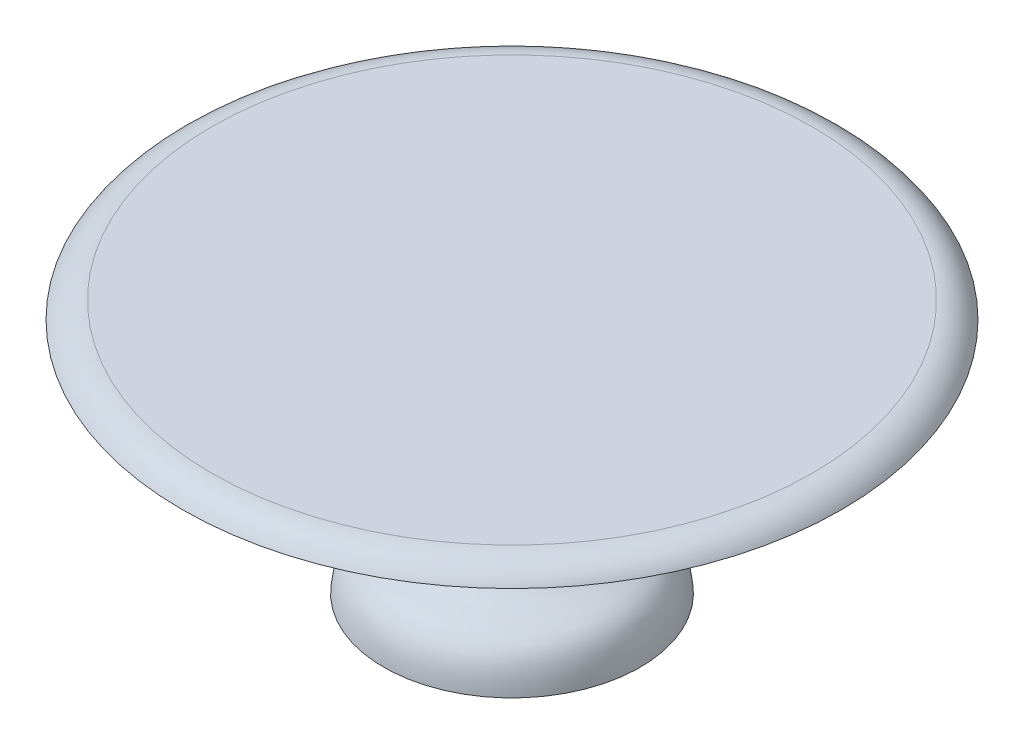
ISO-10303-21;
HEADER;
FILE_DESCRIPTION(('STEP AP214'),'2;1');
FILE_NAME('part.step','',(''),(''),'','','');
FILE_SCHEMA(('AUTOMOTIVE_DESIGN { 1 0 10303 214 1 1 1 1 }'));
ENDSEC;
DATA;
#1=APPLICATION_CONTEXT('core data for automotive mechanical design processes');
#2=APPLICATION_PROTOCOL_DEFINITION('international standard','automotive_design',2000,#1);
#3=PRODUCT_CONTEXT('',#1,'mechanical');
#4=PRODUCT('Part','Part','',(#3));
#5=PRODUCT_RELATED_PRODUCT_CATEGORY('part','',(#4));
#6=PRODUCT_DEFINITION_FORMATION('','',#4);
#7=PRODUCT_DEFINITION_CONTEXT('part definition',#1,'design');
#8=PRODUCT_DEFINITION('design','',#6,#7);
#9=PRODUCT_DEFINITION_SHAPE('','',#8);
#10=(LENGTH_UNIT() NAMED_UNIT(*) SI_UNIT(.MILLI.,.METRE.));
#11=(NAMED_UNIT(*) PLANE_ANGLE_UNIT() SI_UNIT($,.RADIAN.));
#12=(NAMED_UNIT(*) SI_UNIT($,.STERADIAN.) SOLID_ANGLE_UNIT());
#13=UNCERTAINTY_MEASURE_WITH_UNIT(LENGTH_MEASURE(1.E-05),#10,'distance_accuracy_value','');
#14=(GEOMETRIC_REPRESENTATION_CONTEXT(3) GLOBAL_UNCERTAINTY_ASSIGNED_CONTEXT((#13)) GLOBAL_UNIT_ASSIGNED_CONTEXT((#10,
#11,#12)) REPRESENTATION_CONTEXT('',''));
#15=CARTESIAN_POINT('',(0.,0.,0.));
#16=DIRECTION('',(0.,0.,1.));
#17=DIRECTION('',(1.,0.,0.));
#18=AXIS2_PLACEMENT_3D('',#15,#16,#17);
#19=CARTESIAN_POINT('',(0.,15.,0.));
#20=DIRECTION('',(0.,-1.,0.));
#21=DIRECTION('',(0.,0.,-1.));
#22=AXIS2_PLACEMENT_3D('',#19,#20,#21);
#23=PLANE('',#22);
#24=CARTESIAN_POINT('',(0.,15.,0.));
#25=DIRECTION('',(0.,-1.,0.));
#26=DIRECTION('',(0.,0.,-1.));
#27=AXIS2_PLACEMENT_3D('',#24,#25,#26);
#28=CIRCLE('',#27,17.7343631335512);
#29=CARTESIAN_POINT('',(0.,15.,-17.7343631335512));
#30=VERTEX_POINT('',#29);
#31=EDGE_CURVE('E10',#30,#30,#28,.F.);
#32=ORIENTED_EDGE('',*,*,#31,.T.);
#33=EDGE_LOOP('',(#32));
#34=FACE_BOUND('',#33,.T.);
#35=ADVANCED_FACE('F31',(#34),#23,.F.);
#36=CARTESIAN_POINT('',(-19.4664139411201,14.,0.));
#37=DIRECTION('',(0.,1.,0.));
#38=DIRECTION('',(0.,0.,1.));
#39=AXIS2_PLACEMENT_3D('',#36,#37,#38);
#40=PLANE('',#39);
#41=CARTESIAN_POINT('',(0.,14.,0.));
#42=DIRECTION('',(0.,-1.,0.));
#43=DIRECTION('',(0.,0.,-1.));
#44=AXIS2_PLACEMENT_3D('',#41,#42,#43);
#45=CIRCLE('',#44,4.94929513736331);
#46=CARTESIAN_POINT('',(0.,14.,-4.94929513736331));
#47=VERTEX_POINT('',#46);
#48=EDGE_CURVE('E42',#47,#47,#45,.T.);
#49=ORIENTED_EDGE('',*,*,#48,.F.);
#50=EDGE_LOOP('',(#49));
#51=FACE_BOUND('',#50,.T.);
#52=CARTESIAN_POINT('',(0.,14.,0.));
#53=DIRECTION('',(0.,-1.,0.));
#54=DIRECTION('',(0.,0.,-1.));
#55=AXIS2_PLACEMENT_3D('',#52,#53,#54);
#56=CIRCLE('',#55,19.4664139411201);
#57=CARTESIAN_POINT('',(0.,14.,-19.4664139411201));
#58=VERTEX_POINT('',#57);
#59=EDGE_CURVE('E38',#58,#58,#56,.T.);
#60=ORIENTED_EDGE('',*,*,#59,.T.);
#61=EDGE_LOOP('',(#60));
#62=FACE_BOUND('',#61,.T.);
#63=ADVANCED_FACE('F63',(#51,#62),#40,.F.);
#64=CARTESIAN_POINT('',(-4.94929513736331,14.,0.));
#65=CARTESIAN_POINT('',(-3.43951969421745,11.7087002890358,0.));
#66=CARTESIAN_POINT('',(-13.638346404487,2.45672496631757,0.));
#67=CARTESIAN_POINT('',(-0.305701544811699,11.8605694742395,0.));
#68=CARTESIAN_POINT('',(-3.88838336296939,1.64392003360808,0.));
#69=CARTESIAN_POINT('',(-7.3320633344252,3.05540518143739,0.));
#70=CARTESIAN_POINT('',(-7.58258231505098,0.,0.));
#71=B_SPLINE_CURVE_WITH_KNOTS('',3,(#64,#65,#66,#67,#68,#69,#70),.UNSPECIFIED.,.F.,.F.,(4,1,1,1,
4),(0.,0.345471570677227,0.594733291258272,0.813463418158697,1.),.UNSPECIFIED.);
#72=CARTESIAN_POINT('',(0.,0.,0.));
#73=DIRECTION('',(0.,-1.,0.));
#74=AXIS1_PLACEMENT('',#72,#73);
#75=SURFACE_OF_REVOLUTION('',#71,#74);
#76=CARTESIAN_POINT('',(0.,0.,0.));
#77=DIRECTION('',(0.,-1.,0.));
#78=DIRECTION('',(0.,0.,-1.));
#79=AXIS2_PLACEMENT_3D('',#76,#77,#78);
#80=CIRCLE('',#79,7.58258231505098);
#81=CARTESIAN_POINT('',(0.,0.,-7.58258231505098));
#82=VERTEX_POINT('',#81);
#83=EDGE_CURVE('E46',#82,#82,#80,.T.);
#84=ORIENTED_EDGE('',*,*,#83,.F.);
#85=EDGE_LOOP('',(#84));
#86=FACE_BOUND('',#85,.T.);
#87=ORIENTED_EDGE('',*,*,#48,.T.);
#88=EDGE_LOOP('',(#87));
#89=FACE_BOUND('',#88,.T.);
#90=ADVANCED_FACE('F58',(#86,#89),#75,.T.);
#91=CARTESIAN_POINT('',(-7.58258231505098,0.,0.));
#92=DIRECTION('',(0.,1.,0.));
#93=DIRECTION('',(0.,0.,1.));
#94=AXIS2_PLACEMENT_3D('',#91,#92,#93);
#95=PLANE('',#94);
#96=ORIENTED_EDGE('',*,*,#83,.T.);
#97=EDGE_LOOP('',(#96));
#98=FACE_BOUND('',#97,.T.);
#99=ADVANCED_FACE('F62',(#98),#95,.F.);
#100=CARTESIAN_POINT('',(0.,13.,0.));
#101=DIRECTION('',(0.,1.,0.));
#102=DIRECTION('',(0.,0.,1.));
#103=AXIS2_PLACEMENT_3D('',#100,#101,#102);
#104=TOROIDAL_SURFACE('',#103,17.7343631335512,2.);
#105=ORIENTED_EDGE('',*,*,#31,.F.);
#106=EDGE_LOOP('',(#105));
#107=FACE_BOUND('',#106,.T.);
#108=ORIENTED_EDGE('',*,*,#59,.F.);
#109=EDGE_LOOP('',(#108));
#110=FACE_BOUND('',#109,.T.);
#111=ADVANCED_FACE('F33',(#107,#110),#104,.T.);
#112=CLOSED_SHELL('',(#35,#63,#90,#99,#111));
#113=MANIFOLD_SOLID_BREP('B2',#112);
#114=ADVANCED_BREP_SHAPE_REPRESENTATION('',(#18,#113),#14);
#115=SHAPE_DEFINITION_REPRESENTATION(#9,#114);
ENDSEC;
END-ISO-10303-21;
